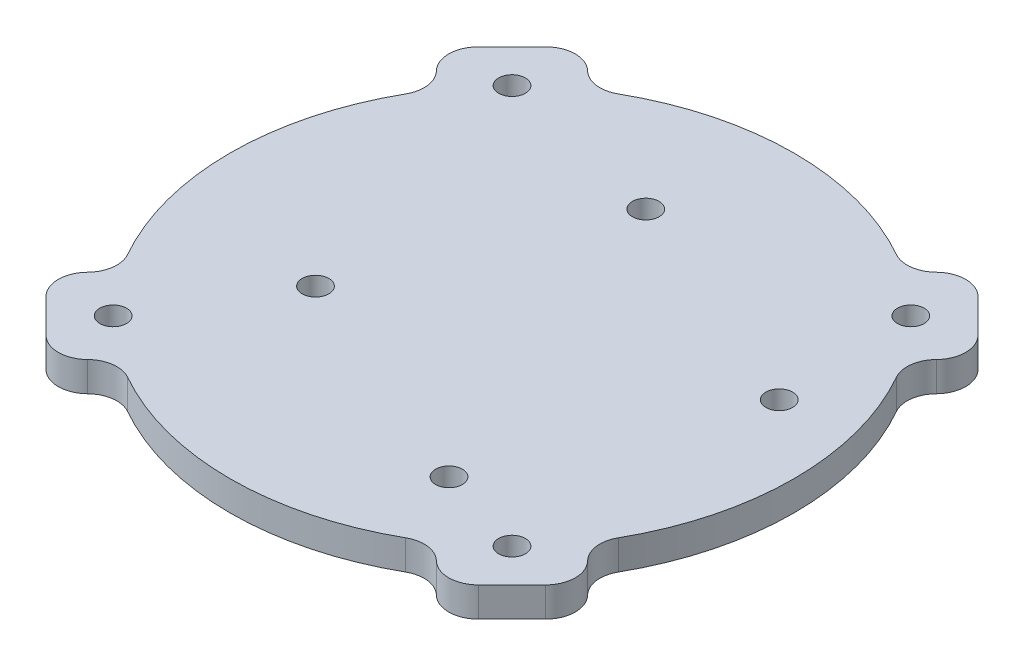
ISO-10303-21;
HEADER;
FILE_DESCRIPTION(('STEP AP214'),'2;1');
FILE_NAME('part.step','',(''),(''),'','','');
FILE_SCHEMA(('AUTOMOTIVE_DESIGN { 1 0 10303 214 1 1 1 1 }'));
ENDSEC;
DATA;
#1=APPLICATION_CONTEXT('core data for automotive mechanical design processes');
#2=APPLICATION_PROTOCOL_DEFINITION('international standard','automotive_design',2000,#1);
#3=PRODUCT_CONTEXT('',#1,'mechanical');
#4=PRODUCT('Part','Part','',(#3));
#5=PRODUCT_RELATED_PRODUCT_CATEGORY('part','',(#4));
#6=PRODUCT_DEFINITION_FORMATION('','',#4);
#7=PRODUCT_DEFINITION_CONTEXT('part definition',#1,'design');
#8=PRODUCT_DEFINITION('design','',#6,#7);
#9=PRODUCT_DEFINITION_SHAPE('','',#8);
#10=(LENGTH_UNIT() NAMED_UNIT(*) SI_UNIT(.MILLI.,.METRE.));
#11=(NAMED_UNIT(*) PLANE_ANGLE_UNIT() SI_UNIT($,.RADIAN.));
#12=(NAMED_UNIT(*) SI_UNIT($,.STERADIAN.) SOLID_ANGLE_UNIT());
#13=UNCERTAINTY_MEASURE_WITH_UNIT(LENGTH_MEASURE(1.E-05),#10,'distance_accuracy_value','');
#14=(GEOMETRIC_REPRESENTATION_CONTEXT(3) GLOBAL_UNCERTAINTY_ASSIGNED_CONTEXT((#13)) GLOBAL_UNIT_ASSIGNED_CONTEXT((#10,
#11,#12)) REPRESENTATION_CONTEXT('',''));
#15=CARTESIAN_POINT('',(0.,0.,0.));
#16=DIRECTION('',(0.,0.,1.));
#17=DIRECTION('',(1.,0.,0.));
#18=AXIS2_PLACEMENT_3D('',#15,#16,#17);
#19=CARTESIAN_POINT('',(0.,5.,0.));
#20=DIRECTION('',(0.,-1.,0.));
#21=DIRECTION('',(0.,0.,-1.));
#22=AXIS2_PLACEMENT_3D('',#19,#20,#21);
#23=CYLINDRICAL_SURFACE('',#22,47.5);
#24=CARTESIAN_POINT('',(0.,0.,0.));
#25=DIRECTION('',(0.,1.,0.));
#26=DIRECTION('',(0.,0.,1.));
#27=AXIS2_PLACEMENT_3D('',#24,#25,#26);
#28=CIRCLE('',#27,47.5);
#29=CARTESIAN_POINT('',(23.4150412443297,0.,-41.3277853692445));
#30=VERTEX_POINT('',#29);
#31=CARTESIAN_POINT('',(-23.4150412443286,0.,-41.3277853692451));
#32=VERTEX_POINT('',#31);
#33=EDGE_CURVE('E284',#30,#32,#28,.T.);
#34=ORIENTED_EDGE('',*,*,#33,.T.);
#35=DIRECTION('',(0.,-1.,0.));
#36=VECTOR('',#35,1.);
#37=CARTESIAN_POINT('',(-23.4150412443286,5.,-41.3277853692452));
#38=LINE('',#37,#36);
#39=CARTESIAN_POINT('',(-23.4150412443286,5.,-41.3277853692451));
#40=VERTEX_POINT('',#39);
#41=EDGE_CURVE('E365',#32,#40,#38,.F.);
#42=ORIENTED_EDGE('',*,*,#41,.T.);
#43=CARTESIAN_POINT('',(0.,5.,0.));
#44=DIRECTION('',(0.,1.,0.));
#45=DIRECTION('',(0.,0.,1.));
#46=AXIS2_PLACEMENT_3D('',#43,#44,#45);
#47=CIRCLE('',#46,47.5);
#48=CARTESIAN_POINT('',(23.4150412443297,5.,-41.3277853692445));
#49=VERTEX_POINT('',#48);
#50=EDGE_CURVE('E229',#49,#40,#47,.T.);
#51=ORIENTED_EDGE('',*,*,#50,.F.);
#52=DIRECTION('',(0.,-1.,0.));
#53=VECTOR('',#52,1.);
#54=CARTESIAN_POINT('',(23.4150412443297,5.,-41.3277853692445));
#55=LINE('',#54,#53);
#56=EDGE_CURVE('E362',#49,#30,#55,.T.);
#57=ORIENTED_EDGE('',*,*,#56,.T.);
#58=EDGE_LOOP('',(#34,#42,#51,#57));
#59=FACE_BOUND('',#58,.T.);
#60=ADVANCED_FACE('F43',(#59),#23,.T.);
#61=CARTESIAN_POINT('',(-32.8804653251737,5.,-38.5373195746675));
#62=DIRECTION('',(0.,-1.,0.));
#63=DIRECTION('',(0.,0.,-1.));
#64=AXIS2_PLACEMENT_3D('',#61,#62,#63);
#65=CYLINDRICAL_SURFACE('',#64,4.99999999999987);
#66=CARTESIAN_POINT('',(-32.8804653251737,5.,-38.5373195746675));
#67=DIRECTION('',(0.,1.,0.));
#68=DIRECTION('',(0.,0.,1.));
#69=AXIS2_PLACEMENT_3D('',#66,#67,#68);
#70=CIRCLE('',#69,4.99999999999987);
#71=CARTESIAN_POINT('',(-36.4159992311063,5.,-42.0728534806003));
#72=VERTEX_POINT('',#71);
#73=CARTESIAN_POINT('',(-29.3801238765579,5.,-42.1076990703376));
#74=VERTEX_POINT('',#73);
#75=EDGE_CURVE('E208',#72,#74,#70,.F.);
#76=ORIENTED_EDGE('',*,*,#75,.T.);
#77=DIRECTION('',(0.,-1.,0.));
#78=VECTOR('',#77,1.);
#79=CARTESIAN_POINT('',(-29.3801238765579,5.,-42.1076990703376));
#80=LINE('',#79,#78);
#81=CARTESIAN_POINT('',(-29.3801238765579,0.,-42.1076990703376));
#82=VERTEX_POINT('',#81);
#83=EDGE_CURVE('E360',#74,#82,#80,.T.);
#84=ORIENTED_EDGE('',*,*,#83,.T.);
#85=CARTESIAN_POINT('',(-32.8804653251737,0.,-38.5373195746675));
#86=DIRECTION('',(0.,1.,0.));
#87=DIRECTION('',(0.,0.,1.));
#88=AXIS2_PLACEMENT_3D('',#85,#86,#87);
#89=CIRCLE('',#88,4.99999999999987);
#90=CARTESIAN_POINT('',(-36.4159992311063,0.,-42.0728534806003));
#91=VERTEX_POINT('',#90);
#92=EDGE_CURVE('E211',#91,#82,#89,.F.);
#93=ORIENTED_EDGE('',*,*,#92,.F.);
#94=DIRECTION('',(0.,-1.,0.));
#95=VECTOR('',#94,1.);
#96=CARTESIAN_POINT('',(-36.4159992311063,5.,-42.0728534806003));
#97=LINE('',#96,#95);
#98=EDGE_CURVE('E204',#72,#91,#97,.T.);
#99=ORIENTED_EDGE('',*,*,#98,.F.);
#100=EDGE_LOOP('',(#76,#84,#93,#99));
#101=FACE_BOUND('',#100,.T.);
#102=ADVANCED_FACE('F206',(#101),#65,.T.);
#103=CARTESIAN_POINT('',(-39.2444263558525,5.,-39.2444263558543));
#104=DIRECTION('',(-0.707106781186531,0.,-0.707106781186564));
#105=DIRECTION('',(-0.707106781186564,0.,0.707106781186531));
#106=AXIS2_PLACEMENT_3D('',#103,#104,#105);
#107=PLANE('',#106);
#108=DIRECTION('',(0.707106781186564,0.,-0.707106781186531));
#109=VECTOR('',#108,1.);
#110=CARTESIAN_POINT('',(-39.2444263558525,0.,-39.2444263558543));
#111=LINE('',#110,#109);
#112=CARTESIAN_POINT('',(-42.0728534805988,0.,-36.4159992311081));
#113=VERTEX_POINT('',#112);
#114=EDGE_CURVE('E287',#113,#91,#111,.T.);
#115=ORIENTED_EDGE('',*,*,#114,.F.);
#116=DIRECTION('',(0.,-1.,0.));
#117=VECTOR('',#116,1.);
#118=CARTESIAN_POINT('',(-42.0728534805988,5.,-36.4159992311081));
#119=LINE('',#118,#117);
#120=CARTESIAN_POINT('',(-42.0728534805988,5.,-36.4159992311081));
#121=VERTEX_POINT('',#120);
#122=EDGE_CURVE('E217',#121,#113,#119,.T.);
#123=ORIENTED_EDGE('',*,*,#122,.F.);
#124=DIRECTION('',(0.707106781186564,0.,-0.707106781186531));
#125=VECTOR('',#124,1.);
#126=CARTESIAN_POINT('',(-39.2444263558525,5.,-39.2444263558543));
#127=LINE('',#126,#125);
#128=EDGE_CURVE('E225',#121,#72,#127,.T.);
#129=ORIENTED_EDGE('',*,*,#128,.T.);
#130=ORIENTED_EDGE('',*,*,#98,.T.);
#131=EDGE_LOOP('',(#115,#123,#129,#130));
#132=FACE_BOUND('',#131,.T.);
#133=ADVANCED_FACE('F231',(#132),#107,.T.);
#134=CARTESIAN_POINT('',(-38.5373195746662,5.,-32.8804653251752));
#135=DIRECTION('',(0.,-1.,0.));
#136=DIRECTION('',(0.,0.,-1.));
#137=AXIS2_PLACEMENT_3D('',#134,#135,#136);
#138=CYLINDRICAL_SURFACE('',#137,5.00000000000013);
#139=CARTESIAN_POINT('',(-38.5373195746662,0.,-32.8804653251752));
#140=DIRECTION('',(0.,1.,0.));
#141=DIRECTION('',(0.,0.,1.));
#142=AXIS2_PLACEMENT_3D('',#139,#140,#141);
#143=CIRCLE('',#142,5.00000000000013);
#144=CARTESIAN_POINT('',(-42.1076990703366,0.,-29.3801238765594));
#145=VERTEX_POINT('',#144);
#146=EDGE_CURVE('E289',#113,#145,#143,.T.);
#147=ORIENTED_EDGE('',*,*,#146,.T.);
#148=DIRECTION('',(0.,-1.,0.));
#149=VECTOR('',#148,1.);
#150=CARTESIAN_POINT('',(-42.1076990703366,5.,-29.3801238765594));
#151=LINE('',#150,#149);
#152=CARTESIAN_POINT('',(-42.1076990703366,5.,-29.3801238765594));
#153=VERTEX_POINT('',#152);
#154=EDGE_CURVE('E358',#145,#153,#151,.F.);
#155=ORIENTED_EDGE('',*,*,#154,.T.);
#156=CARTESIAN_POINT('',(-38.5373195746662,5.,-32.8804653251752));
#157=DIRECTION('',(0.,1.,0.));
#158=DIRECTION('',(0.,0.,1.));
#159=AXIS2_PLACEMENT_3D('',#156,#157,#158);
#160=CIRCLE('',#159,5.00000000000013);
#161=EDGE_CURVE('E233',#121,#153,#160,.T.);
#162=ORIENTED_EDGE('',*,*,#161,.F.);
#163=ORIENTED_EDGE('',*,*,#122,.T.);
#164=EDGE_LOOP('',(#147,#155,#162,#163));
#165=FACE_BOUND('',#164,.T.);
#166=ADVANCED_FACE('F462',(#165),#138,.T.);
#167=CARTESIAN_POINT('',(-41.3277853692443,0.,-23.41504124433));
#168=VERTEX_POINT('',#167);
#169=CARTESIAN_POINT('',(-41.3277853692451,0.,23.4150412443287));
#170=VERTEX_POINT('',#169);
#171=EDGE_CURVE('E292',#168,#170,#28,.T.);
#172=ORIENTED_EDGE('',*,*,#171,.T.);
#173=DIRECTION('',(0.,-1.,0.));
#174=VECTOR('',#173,1.);
#175=CARTESIAN_POINT('',(-41.3277853692451,5.,23.4150412443287));
#176=LINE('',#175,#174);
#177=CARTESIAN_POINT('',(-41.3277853692451,5.,23.4150412443287));
#178=VERTEX_POINT('',#177);
#179=EDGE_CURVE('E356',#170,#178,#176,.F.);
#180=ORIENTED_EDGE('',*,*,#179,.T.);
#181=CARTESIAN_POINT('',(-41.3277853692443,5.,-23.41504124433));
#182=VERTEX_POINT('',#181);
#183=EDGE_CURVE('E235',#182,#178,#47,.T.);
#184=ORIENTED_EDGE('',*,*,#183,.F.);
#185=DIRECTION('',(0.,-1.,0.));
#186=VECTOR('',#185,1.);
#187=CARTESIAN_POINT('',(-41.3277853692443,5.,-23.41504124433));
#188=LINE('',#187,#186);
#189=EDGE_CURVE('E353',#182,#168,#188,.T.);
#190=ORIENTED_EDGE('',*,*,#189,.T.);
#191=EDGE_LOOP('',(#172,#180,#184,#190));
#192=FACE_BOUND('',#191,.T.);
#193=ADVANCED_FACE('F469',(#192),#23,.T.);
#194=CARTESIAN_POINT('',(-38.5373195746674,5.,32.8804653251738));
#195=DIRECTION('',(0.,-1.,0.));
#196=DIRECTION('',(0.,0.,-1.));
#197=AXIS2_PLACEMENT_3D('',#194,#195,#196);
#198=CYLINDRICAL_SURFACE('',#197,4.99999999999988);
#199=CARTESIAN_POINT('',(-38.5373195746674,5.,32.8804653251738));
#200=DIRECTION('',(0.,1.,0.));
#201=DIRECTION('',(0.,0.,1.));
#202=AXIS2_PLACEMENT_3D('',#199,#200,#201);
#203=CIRCLE('',#202,4.99999999999988);
#204=CARTESIAN_POINT('',(-42.0728534806002,5.,36.4159992311065));
#205=VERTEX_POINT('',#204);
#206=CARTESIAN_POINT('',(-42.1076990703375,5.,29.3801238765581));
#207=VERTEX_POINT('',#206);
#208=EDGE_CURVE('E239',#205,#207,#203,.F.);
#209=ORIENTED_EDGE('',*,*,#208,.T.);
#210=DIRECTION('',(0.,-1.,0.));
#211=VECTOR('',#210,1.);
#212=CARTESIAN_POINT('',(-42.1076990703375,5.,29.3801238765581));
#213=LINE('',#212,#211);
#214=CARTESIAN_POINT('',(-42.1076990703375,0.,29.3801238765581));
#215=VERTEX_POINT('',#214);
#216=EDGE_CURVE('E350',#207,#215,#213,.T.);
#217=ORIENTED_EDGE('',*,*,#216,.T.);
#218=CARTESIAN_POINT('',(-38.5373195746674,0.,32.8804653251738));
#219=DIRECTION('',(0.,1.,0.));
#220=DIRECTION('',(0.,0.,1.));
#221=AXIS2_PLACEMENT_3D('',#218,#219,#220);
#222=CIRCLE('',#221,4.99999999999988);
#223=CARTESIAN_POINT('',(-42.0728534806002,0.,36.4159992311065));
#224=VERTEX_POINT('',#223);
#225=EDGE_CURVE('E293',#224,#215,#222,.F.);
#226=ORIENTED_EDGE('',*,*,#225,.F.);
#227=DIRECTION('',(0.,-1.,0.));
#228=VECTOR('',#227,1.);
#229=CARTESIAN_POINT('',(-42.0728534806002,5.,36.4159992311065));
#230=LINE('',#229,#228);
#231=EDGE_CURVE('E338',#205,#224,#230,.T.);
#232=ORIENTED_EDGE('',*,*,#231,.F.);
#233=EDGE_LOOP('',(#209,#217,#226,#232));
#234=FACE_BOUND('',#233,.T.);
#235=ADVANCED_FACE('F477',(#234),#198,.T.);
#236=CARTESIAN_POINT('',(-39.2444263558541,5.,39.2444263558527));
#237=DIRECTION('',(-0.70710678118656,0.,0.707106781186535));
#238=DIRECTION('',(0.707106781186535,0.,0.70710678118656));
#239=AXIS2_PLACEMENT_3D('',#236,#237,#238);
#240=PLANE('',#239);
#241=DIRECTION('',(-0.707106781186535,0.,-0.70710678118656));
#242=VECTOR('',#241,1.);
#243=CARTESIAN_POINT('',(-39.2444263558541,0.,39.2444263558527));
#244=LINE('',#243,#242);
#245=CARTESIAN_POINT('',(-36.4159992311079,0.,42.0728534805989));
#246=VERTEX_POINT('',#245);
#247=EDGE_CURVE('E296',#246,#224,#244,.T.);
#248=ORIENTED_EDGE('',*,*,#247,.F.);
#249=DIRECTION('',(0.,-1.,0.));
#250=VECTOR('',#249,1.);
#251=CARTESIAN_POINT('',(-36.4159992311079,5.,42.0728534805989));
#252=LINE('',#251,#250);
#253=CARTESIAN_POINT('',(-36.4159992311079,5.,42.0728534805989));
#254=VERTEX_POINT('',#253);
#255=EDGE_CURVE('E336',#254,#246,#252,.T.);
#256=ORIENTED_EDGE('',*,*,#255,.F.);
#257=DIRECTION('',(-0.707106781186535,0.,-0.70710678118656));
#258=VECTOR('',#257,1.);
#259=CARTESIAN_POINT('',(-39.2444263558541,5.,39.2444263558527));
#260=LINE('',#259,#258);
#261=EDGE_CURVE('E242',#254,#205,#260,.T.);
#262=ORIENTED_EDGE('',*,*,#261,.T.);
#263=ORIENTED_EDGE('',*,*,#231,.T.);
#264=EDGE_LOOP('',(#248,#256,#262,#263));
#265=FACE_BOUND('',#264,.T.);
#266=ADVANCED_FACE('F481',(#265),#240,.T.);
#267=CARTESIAN_POINT('',(-32.8804653251751,5.,38.5373195746663));
#268=DIRECTION('',(0.,-1.,0.));
#269=DIRECTION('',(0.,0.,-1.));
#270=AXIS2_PLACEMENT_3D('',#267,#268,#269);
#271=CYLINDRICAL_SURFACE('',#270,5.00000000000012);
#272=CARTESIAN_POINT('',(-32.8804653251751,0.,38.5373195746663));
#273=DIRECTION('',(0.,1.,0.));
#274=DIRECTION('',(0.,0.,1.));
#275=AXIS2_PLACEMENT_3D('',#272,#273,#274);
#276=CIRCLE('',#275,5.00000000000012);
#277=CARTESIAN_POINT('',(-29.3801238765593,0.,42.1076990703367));
#278=VERTEX_POINT('',#277);
#279=EDGE_CURVE('E299',#246,#278,#276,.T.);
#280=ORIENTED_EDGE('',*,*,#279,.T.);
#281=DIRECTION('',(0.,-1.,0.));
#282=VECTOR('',#281,1.);
#283=CARTESIAN_POINT('',(-29.3801238765593,5.,42.1076990703367));
#284=LINE('',#283,#282);
#285=CARTESIAN_POINT('',(-29.3801238765593,5.,42.1076990703367));
#286=VERTEX_POINT('',#285);
#287=EDGE_CURVE('E348',#278,#286,#284,.F.);
#288=ORIENTED_EDGE('',*,*,#287,.T.);
#289=CARTESIAN_POINT('',(-32.8804653251751,5.,38.5373195746663));
#290=DIRECTION('',(0.,1.,0.));
#291=DIRECTION('',(0.,0.,1.));
#292=AXIS2_PLACEMENT_3D('',#289,#290,#291);
#293=CIRCLE('',#292,5.00000000000012);
#294=EDGE_CURVE('E245',#254,#286,#293,.T.);
#295=ORIENTED_EDGE('',*,*,#294,.F.);
#296=ORIENTED_EDGE('',*,*,#255,.T.);
#297=EDGE_LOOP('',(#280,#288,#295,#296));
#298=FACE_BOUND('',#297,.T.);
#299=ADVANCED_FACE('F488',(#298),#271,.T.);
#300=CARTESIAN_POINT('',(-23.4150412443299,0.,41.3277853692444));
#301=VERTEX_POINT('',#300);
#302=CARTESIAN_POINT('',(23.4150412443288,0.,41.327785369245));
#303=VERTEX_POINT('',#302);
#304=EDGE_CURVE('E285',#301,#303,#28,.T.);
#305=ORIENTED_EDGE('',*,*,#304,.T.);
#306=DIRECTION('',(0.,-1.,0.));
#307=VECTOR('',#306,1.);
#308=CARTESIAN_POINT('',(23.4150412443288,5.,41.327785369245));
#309=LINE('',#308,#307);
#310=CARTESIAN_POINT('',(23.4150412443288,5.,41.327785369245));
#311=VERTEX_POINT('',#310);
#312=EDGE_CURVE('E346',#303,#311,#309,.F.);
#313=ORIENTED_EDGE('',*,*,#312,.T.);
#314=CARTESIAN_POINT('',(-23.4150412443299,5.,41.3277853692444));
#315=VERTEX_POINT('',#314);
#316=EDGE_CURVE('E248',#315,#311,#47,.T.);
#317=ORIENTED_EDGE('',*,*,#316,.F.);
#318=DIRECTION('',(0.,-1.,0.));
#319=VECTOR('',#318,1.);
#320=CARTESIAN_POINT('',(-23.4150412443299,5.,41.3277853692444));
#321=LINE('',#320,#319);
#322=EDGE_CURVE('E343',#315,#301,#321,.T.);
#323=ORIENTED_EDGE('',*,*,#322,.T.);
#324=EDGE_LOOP('',(#305,#313,#317,#323));
#325=FACE_BOUND('',#324,.T.);
#326=ADVANCED_FACE('F439',(#325),#23,.T.);
#327=CARTESIAN_POINT('',(32.8804653251739,5.,38.5373195746673));
#328=DIRECTION('',(0.,-1.,0.));
#329=DIRECTION('',(0.,0.,-1.));
#330=AXIS2_PLACEMENT_3D('',#327,#328,#329);
#331=CYLINDRICAL_SURFACE('',#330,4.99999999999987);
#332=CARTESIAN_POINT('',(32.8804653251739,5.,38.5373195746673));
#333=DIRECTION('',(0.,1.,0.));
#334=DIRECTION('',(0.,0.,1.));
#335=AXIS2_PLACEMENT_3D('',#332,#333,#334);
#336=CIRCLE('',#335,4.99999999999987);
#337=CARTESIAN_POINT('',(36.4159992311066,5.,42.0728534806));
#338=VERTEX_POINT('',#337);
#339=CARTESIAN_POINT('',(29.3801238765582,5.,42.1076990703374));
#340=VERTEX_POINT('',#339);
#341=EDGE_CURVE('E249',#338,#340,#336,.F.);
#342=ORIENTED_EDGE('',*,*,#341,.T.);
#343=DIRECTION('',(0.,-1.,0.));
#344=VECTOR('',#343,1.);
#345=CARTESIAN_POINT('',(29.3801238765582,5.,42.1076990703374));
#346=LINE('',#345,#344);
#347=CARTESIAN_POINT('',(29.3801238765582,0.,42.1076990703374));
#348=VERTEX_POINT('',#347);
#349=EDGE_CURVE('E216',#340,#348,#346,.T.);
#350=ORIENTED_EDGE('',*,*,#349,.T.);
#351=CARTESIAN_POINT('',(32.8804653251739,0.,38.5373195746673));
#352=DIRECTION('',(0.,1.,0.));
#353=DIRECTION('',(0.,0.,1.));
#354=AXIS2_PLACEMENT_3D('',#351,#352,#353);
#355=CIRCLE('',#354,4.99999999999987);
#356=CARTESIAN_POINT('',(36.4159992311066,0.,42.0728534806));
#357=VERTEX_POINT('',#356);
#358=EDGE_CURVE('E302',#357,#348,#355,.F.);
#359=ORIENTED_EDGE('',*,*,#358,.F.);
#360=DIRECTION('',(0.,-1.,0.));
#361=VECTOR('',#360,1.);
#362=CARTESIAN_POINT('',(36.4159992311066,5.,42.0728534806));
#363=LINE('',#362,#361);
#364=EDGE_CURVE('E334',#338,#357,#363,.T.);
#365=ORIENTED_EDGE('',*,*,#364,.F.);
#366=EDGE_LOOP('',(#342,#350,#359,#365));
#367=FACE_BOUND('',#366,.T.);
#368=ADVANCED_FACE('F432',(#367),#331,.T.);
#369=CARTESIAN_POINT('',(39.2444263558528,5.,39.244426355854));
#370=DIRECTION('',(0.707106781186537,0.,0.707106781186558));
#371=DIRECTION('',(0.707106781186558,0.,-0.707106781186537));
#372=AXIS2_PLACEMENT_3D('',#369,#370,#371);
#373=PLANE('',#372);
#374=DIRECTION('',(-0.707106781186558,0.,0.707106781186537));
#375=VECTOR('',#374,1.);
#376=CARTESIAN_POINT('',(39.2444263558528,0.,39.244426355854));
#377=LINE('',#376,#375);
#378=CARTESIAN_POINT('',(42.0728534805991,0.,36.4159992311078));
#379=VERTEX_POINT('',#378);
#380=EDGE_CURVE('E305',#379,#357,#377,.T.);
#381=ORIENTED_EDGE('',*,*,#380,.F.);
#382=DIRECTION('',(0.,-1.,0.));
#383=VECTOR('',#382,1.);
#384=CARTESIAN_POINT('',(42.0728534805991,5.,36.4159992311078));
#385=LINE('',#384,#383);
#386=CARTESIAN_POINT('',(42.0728534805991,5.,36.4159992311078));
#387=VERTEX_POINT('',#386);
#388=EDGE_CURVE('E332',#387,#379,#385,.T.);
#389=ORIENTED_EDGE('',*,*,#388,.F.);
#390=DIRECTION('',(-0.707106781186558,0.,0.707106781186537));
#391=VECTOR('',#390,1.);
#392=CARTESIAN_POINT('',(39.2444263558528,5.,39.244426355854));
#393=LINE('',#392,#391);
#394=EDGE_CURVE('E252',#387,#338,#393,.T.);
#395=ORIENTED_EDGE('',*,*,#394,.T.);
#396=ORIENTED_EDGE('',*,*,#364,.T.);
#397=EDGE_LOOP('',(#381,#389,#395,#396));
#398=FACE_BOUND('',#397,.T.);
#399=ADVANCED_FACE('F429',(#398),#373,.T.);
#400=CARTESIAN_POINT('',(38.5373195746664,5.,32.880465325175));
#401=DIRECTION('',(0.,-1.,0.));
#402=DIRECTION('',(0.,0.,-1.));
#403=AXIS2_PLACEMENT_3D('',#400,#401,#402);
#404=CYLINDRICAL_SURFACE('',#403,5.00000000000013);
#405=CARTESIAN_POINT('',(38.5373195746664,0.,32.880465325175));
#406=DIRECTION('',(0.,1.,0.));
#407=DIRECTION('',(0.,0.,1.));
#408=AXIS2_PLACEMENT_3D('',#405,#406,#407);
#409=CIRCLE('',#408,5.00000000000013);
#410=CARTESIAN_POINT('',(42.1076990703367,0.,29.3801238765592));
#411=VERTEX_POINT('',#410);
#412=EDGE_CURVE('E283',#379,#411,#409,.T.);
#413=ORIENTED_EDGE('',*,*,#412,.T.);
#414=DIRECTION('',(0.,-1.,0.));
#415=VECTOR('',#414,1.);
#416=CARTESIAN_POINT('',(42.1076990703367,5.,29.3801238765592));
#417=LINE('',#416,#415);
#418=CARTESIAN_POINT('',(42.1076990703367,5.,29.3801238765592));
#419=VERTEX_POINT('',#418);
#420=EDGE_CURVE('E58',#411,#419,#417,.F.);
#421=ORIENTED_EDGE('',*,*,#420,.T.);
#422=CARTESIAN_POINT('',(38.5373195746664,5.,32.880465325175));
#423=DIRECTION('',(0.,1.,0.));
#424=DIRECTION('',(0.,0.,1.));
#425=AXIS2_PLACEMENT_3D('',#422,#423,#424);
#426=CIRCLE('',#425,5.00000000000013);
#427=EDGE_CURVE('E255',#387,#419,#426,.T.);
#428=ORIENTED_EDGE('',*,*,#427,.F.);
#429=ORIENTED_EDGE('',*,*,#388,.T.);
#430=EDGE_LOOP('',(#413,#421,#428,#429));
#431=FACE_BOUND('',#430,.T.);
#432=ADVANCED_FACE('F426',(#431),#404,.T.);
#433=CARTESIAN_POINT('',(41.3277853692445,0.,23.4150412443298));
#434=VERTEX_POINT('',#433);
#435=CARTESIAN_POINT('',(41.3277853692449,0.,-23.415041244329));
#436=VERTEX_POINT('',#435);
#437=EDGE_CURVE('E279',#434,#436,#28,.T.);
#438=ORIENTED_EDGE('',*,*,#437,.T.);
#439=DIRECTION('',(0.,-1.,0.));
#440=VECTOR('',#439,1.);
#441=CARTESIAN_POINT('',(41.3277853692449,5.,-23.415041244329));
#442=LINE('',#441,#440);
#443=CARTESIAN_POINT('',(41.3277853692449,5.,-23.415041244329));
#444=VERTEX_POINT('',#443);
#445=EDGE_CURVE('E375',#436,#444,#442,.F.);
#446=ORIENTED_EDGE('',*,*,#445,.T.);
#447=CARTESIAN_POINT('',(41.3277853692445,5.,23.4150412443298));
#448=VERTEX_POINT('',#447);
#449=EDGE_CURVE('E257',#448,#444,#47,.T.);
#450=ORIENTED_EDGE('',*,*,#449,.F.);
#451=DIRECTION('',(0.,-1.,0.));
#452=VECTOR('',#451,1.);
#453=CARTESIAN_POINT('',(41.3277853692445,5.,23.4150412443298));
#454=LINE('',#453,#452);
#455=EDGE_CURVE('E372',#448,#434,#454,.T.);
#456=ORIENTED_EDGE('',*,*,#455,.T.);
#457=EDGE_LOOP('',(#438,#446,#450,#456));
#458=FACE_BOUND('',#457,.T.);
#459=ADVANCED_FACE('F420',(#458),#23,.T.);
#460=CARTESIAN_POINT('',(38.5373195746672,5.,-32.8804653251741));
#461=DIRECTION('',(0.,-1.,0.));
#462=DIRECTION('',(0.,0.,-1.));
#463=AXIS2_PLACEMENT_3D('',#460,#461,#462);
#464=CYLINDRICAL_SURFACE('',#463,4.99999999999988);
#465=CARTESIAN_POINT('',(38.5373195746672,5.,-32.8804653251741));
#466=DIRECTION('',(0.,1.,0.));
#467=DIRECTION('',(0.,0.,1.));
#468=AXIS2_PLACEMENT_3D('',#465,#466,#467);
#469=CIRCLE('',#468,4.99999999999988);
#470=CARTESIAN_POINT('',(42.0728534805999,5.,-36.4159992311068));
#471=VERTEX_POINT('',#470);
#472=CARTESIAN_POINT('',(42.1076990703373,5.,-29.3801238765584));
#473=VERTEX_POINT('',#472);
#474=EDGE_CURVE('E258',#471,#473,#469,.F.);
#475=ORIENTED_EDGE('',*,*,#474,.T.);
#476=DIRECTION('',(0.,-1.,0.));
#477=VECTOR('',#476,1.);
#478=CARTESIAN_POINT('',(42.1076990703373,5.,-29.3801238765584));
#479=LINE('',#478,#477);
#480=CARTESIAN_POINT('',(42.1076990703373,0.,-29.3801238765584));
#481=VERTEX_POINT('',#480);
#482=EDGE_CURVE('E369',#473,#481,#479,.T.);
#483=ORIENTED_EDGE('',*,*,#482,.T.);
#484=CARTESIAN_POINT('',(38.5373195746672,0.,-32.8804653251741));
#485=DIRECTION('',(0.,1.,0.));
#486=DIRECTION('',(0.,0.,1.));
#487=AXIS2_PLACEMENT_3D('',#484,#485,#486);
#488=CIRCLE('',#487,4.99999999999988);
#489=CARTESIAN_POINT('',(42.0728534805999,0.,-36.4159992311068));
#490=VERTEX_POINT('',#489);
#491=EDGE_CURVE('E282',#490,#481,#488,.F.);
#492=ORIENTED_EDGE('',*,*,#491,.F.);
#493=DIRECTION('',(0.,-1.,0.));
#494=VECTOR('',#493,1.);
#495=CARTESIAN_POINT('',(42.0728534805999,5.,-36.4159992311068));
#496=LINE('',#495,#494);
#497=EDGE_CURVE('E330',#471,#490,#496,.T.);
#498=ORIENTED_EDGE('',*,*,#497,.F.);
#499=EDGE_LOOP('',(#475,#483,#492,#498));
#500=FACE_BOUND('',#499,.T.);
#501=ADVANCED_FACE('F413',(#500),#464,.T.);
#502=CARTESIAN_POINT('',(39.2444263558538,5.,-39.2444263558529));
#503=DIRECTION('',(0.707106781186556,0.,-0.707106781186539));
#504=DIRECTION('',(-0.707106781186539,0.,-0.707106781186556));
#505=AXIS2_PLACEMENT_3D('',#502,#503,#504);
#506=PLANE('',#505);
#507=DIRECTION('',(0.707106781186539,0.,0.707106781186556));
#508=VECTOR('',#507,1.);
#509=CARTESIAN_POINT('',(39.2444263558538,0.,-39.2444263558529));
#510=LINE('',#509,#508);
#511=CARTESIAN_POINT('',(36.4159992311077,0.,-42.0728534805992));
#512=VERTEX_POINT('',#511);
#513=EDGE_CURVE('E311',#512,#490,#510,.T.);
#514=ORIENTED_EDGE('',*,*,#513,.F.);
#515=DIRECTION('',(0.,-1.,0.));
#516=VECTOR('',#515,1.);
#517=CARTESIAN_POINT('',(36.4159992311077,5.,-42.0728534805992));
#518=LINE('',#517,#516);
#519=CARTESIAN_POINT('',(36.4159992311077,5.,-42.0728534805992));
#520=VERTEX_POINT('',#519);
#521=EDGE_CURVE('E278',#520,#512,#518,.T.);
#522=ORIENTED_EDGE('',*,*,#521,.F.);
#523=DIRECTION('',(0.707106781186539,0.,0.707106781186556));
#524=VECTOR('',#523,1.);
#525=CARTESIAN_POINT('',(39.2444263558538,5.,-39.2444263558529));
#526=LINE('',#525,#524);
#527=EDGE_CURVE('E261',#520,#471,#526,.T.);
#528=ORIENTED_EDGE('',*,*,#527,.T.);
#529=ORIENTED_EDGE('',*,*,#497,.T.);
#530=EDGE_LOOP('',(#514,#522,#528,#529));
#531=FACE_BOUND('',#530,.T.);
#532=ADVANCED_FACE('F513',(#531),#506,.T.);
#533=CARTESIAN_POINT('',(-33.5875721063614,5.,33.5875721063606));
#534=DIRECTION('',(0.,-1.,0.));
#535=DIRECTION('',(0.,0.,-1.));
#536=AXIS2_PLACEMENT_3D('',#533,#534,#535);
#537=CYLINDRICAL_SURFACE('',#536,2.25);
#538=CARTESIAN_POINT('',(-33.5875721063614,5.,33.5875721063606));
#539=DIRECTION('',(0.,1.,0.));
#540=DIRECTION('',(0.,0.,1.));
#541=AXIS2_PLACEMENT_3D('',#538,#539,#540);
#542=CIRCLE('',#541,2.25);
#543=CARTESIAN_POINT('',(-33.5875721063614,5.,35.8375721063606));
#544=VERTEX_POINT('',#543);
#545=EDGE_CURVE('E272',#544,#544,#542,.T.);
#546=ORIENTED_EDGE('',*,*,#545,.T.);
#547=EDGE_LOOP('',(#546));
#548=FACE_BOUND('',#547,.T.);
#549=CARTESIAN_POINT('',(-33.5875721063614,0.,33.5875721063606));
#550=DIRECTION('',(0.,1.,0.));
#551=DIRECTION('',(0.,0.,1.));
#552=AXIS2_PLACEMENT_3D('',#549,#550,#551);
#553=CIRCLE('',#552,2.25);
#554=CARTESIAN_POINT('',(-33.5875721063614,0.,35.8375721063606));
#555=VERTEX_POINT('',#554);
#556=EDGE_CURVE('E323',#555,#555,#553,.T.);
#557=ORIENTED_EDGE('',*,*,#556,.F.);
#558=EDGE_LOOP('',(#557));
#559=FACE_BOUND('',#558,.T.);
#560=ADVANCED_FACE('F643',(#548,#559),#537,.F.);
#561=CARTESIAN_POINT('',(-33.5875721063605,5.,-33.5875721063615));
#562=DIRECTION('',(0.,-1.,0.));
#563=DIRECTION('',(0.,0.,-1.));
#564=AXIS2_PLACEMENT_3D('',#561,#562,#563);
#565=CYLINDRICAL_SURFACE('',#564,2.25);
#566=CARTESIAN_POINT('',(-33.5875721063605,5.,-33.5875721063615));
#567=DIRECTION('',(0.,1.,0.));
#568=DIRECTION('',(0.,0.,1.));
#569=AXIS2_PLACEMENT_3D('',#566,#567,#568);
#570=CIRCLE('',#569,2.25);
#571=CARTESIAN_POINT('',(-33.5875721063605,5.,-31.3375721063615));
#572=VERTEX_POINT('',#571);
#573=EDGE_CURVE('E269',#572,#572,#570,.T.);
#574=ORIENTED_EDGE('',*,*,#573,.T.);
#575=EDGE_LOOP('',(#574));
#576=FACE_BOUND('',#575,.T.);
#577=CARTESIAN_POINT('',(-33.5875721063605,0.,-33.5875721063615));
#578=DIRECTION('',(0.,1.,0.));
#579=DIRECTION('',(0.,0.,1.));
#580=AXIS2_PLACEMENT_3D('',#577,#578,#579);
#581=CIRCLE('',#580,2.25);
#582=CARTESIAN_POINT('',(-33.5875721063605,0.,-31.3375721063615));
#583=VERTEX_POINT('',#582);
#584=EDGE_CURVE('E320',#583,#583,#581,.T.);
#585=ORIENTED_EDGE('',*,*,#584,.F.);
#586=EDGE_LOOP('',(#585));
#587=FACE_BOUND('',#586,.T.);
#588=ADVANCED_FACE('F646',(#576,#587),#565,.F.);
#589=CARTESIAN_POINT('',(33.5875721063612,5.,-33.5875721063608));
#590=DIRECTION('',(0.,-1.,0.));
#591=DIRECTION('',(0.,0.,-1.));
#592=AXIS2_PLACEMENT_3D('',#589,#590,#591);
#593=CYLINDRICAL_SURFACE('',#592,2.25);
#594=CARTESIAN_POINT('',(33.5875721063612,5.,-33.5875721063608));
#595=DIRECTION('',(0.,1.,0.));
#596=DIRECTION('',(0.,0.,1.));
#597=AXIS2_PLACEMENT_3D('',#594,#595,#596);
#598=CIRCLE('',#597,2.25);
#599=CARTESIAN_POINT('',(33.5875721063612,5.,-31.3375721063608));
#600=VERTEX_POINT('',#599);
#601=EDGE_CURVE('E266',#600,#600,#598,.T.);
#602=ORIENTED_EDGE('',*,*,#601,.T.);
#603=EDGE_LOOP('',(#602));
#604=FACE_BOUND('',#603,.T.);
#605=CARTESIAN_POINT('',(33.5875721063612,0.,-33.5875721063608));
#606=DIRECTION('',(0.,1.,0.));
#607=DIRECTION('',(0.,0.,1.));
#608=AXIS2_PLACEMENT_3D('',#605,#606,#607);
#609=CIRCLE('',#608,2.25);
#610=CARTESIAN_POINT('',(33.5875721063612,0.,-31.3375721063608));
#611=VERTEX_POINT('',#610);
#612=EDGE_CURVE('E317',#611,#611,#609,.T.);
#613=ORIENTED_EDGE('',*,*,#612,.F.);
#614=EDGE_LOOP('',(#613));
#615=FACE_BOUND('',#614,.T.);
#616=ADVANCED_FACE('F650',(#604,#615),#593,.F.);
#617=CARTESIAN_POINT('',(32.8804653251748,5.,-38.5373195746665));
#618=DIRECTION('',(0.,-1.,0.));
#619=DIRECTION('',(0.,0.,-1.));
#620=AXIS2_PLACEMENT_3D('',#617,#618,#619);
#621=CYLINDRICAL_SURFACE('',#620,5.00000000000013);
#622=CARTESIAN_POINT('',(32.8804653251748,0.,-38.5373195746665));
#623=DIRECTION('',(0.,1.,0.));
#624=DIRECTION('',(0.,0.,1.));
#625=AXIS2_PLACEMENT_3D('',#622,#623,#624);
#626=CIRCLE('',#625,5.00000000000013);
#627=CARTESIAN_POINT('',(29.380123876559,0.,-42.1076990703369));
#628=VERTEX_POINT('',#627);
#629=EDGE_CURVE('E314',#512,#628,#626,.T.);
#630=ORIENTED_EDGE('',*,*,#629,.T.);
#631=DIRECTION('',(0.,-1.,0.));
#632=VECTOR('',#631,1.);
#633=CARTESIAN_POINT('',(29.380123876559,5.,-42.1076990703369));
#634=LINE('',#633,#632);
#635=CARTESIAN_POINT('',(29.380123876559,5.,-42.1076990703369));
#636=VERTEX_POINT('',#635);
#637=EDGE_CURVE('E367',#628,#636,#634,.F.);
#638=ORIENTED_EDGE('',*,*,#637,.T.);
#639=CARTESIAN_POINT('',(32.8804653251748,5.,-38.5373195746665));
#640=DIRECTION('',(0.,1.,0.));
#641=DIRECTION('',(0.,0.,1.));
#642=AXIS2_PLACEMENT_3D('',#639,#640,#641);
#643=CIRCLE('',#642,5.00000000000013);
#644=EDGE_CURVE('E264',#520,#636,#643,.T.);
#645=ORIENTED_EDGE('',*,*,#644,.F.);
#646=ORIENTED_EDGE('',*,*,#521,.T.);
#647=EDGE_LOOP('',(#630,#638,#645,#646));
#648=FACE_BOUND('',#647,.T.);
#649=ADVANCED_FACE('F641',(#648),#621,.T.);
#650=CARTESIAN_POINT('',(33.5875721063607,5.,33.5875721063613));
#651=DIRECTION('',(0.,-1.,0.));
#652=DIRECTION('',(0.,0.,-1.));
#653=AXIS2_PLACEMENT_3D('',#650,#651,#652);
#654=CYLINDRICAL_SURFACE('',#653,2.25);
#655=CARTESIAN_POINT('',(33.5875721063607,5.,33.5875721063613));
#656=DIRECTION('',(0.,1.,0.));
#657=DIRECTION('',(0.,0.,1.));
#658=AXIS2_PLACEMENT_3D('',#655,#656,#657);
#659=CIRCLE('',#658,2.25);
#660=CARTESIAN_POINT('',(33.5875721063607,5.,35.8375721063613));
#661=VERTEX_POINT('',#660);
#662=EDGE_CURVE('E275',#661,#661,#659,.T.);
#663=ORIENTED_EDGE('',*,*,#662,.T.);
#664=EDGE_LOOP('',(#663));
#665=FACE_BOUND('',#664,.T.);
#666=CARTESIAN_POINT('',(33.5875721063607,0.,33.5875721063613));
#667=DIRECTION('',(0.,1.,0.));
#668=DIRECTION('',(0.,0.,1.));
#669=AXIS2_PLACEMENT_3D('',#666,#667,#668);
#670=CIRCLE('',#669,2.25);
#671=CARTESIAN_POINT('',(33.5875721063607,0.,35.8375721063613));
#672=VERTEX_POINT('',#671);
#673=EDGE_CURVE('E326',#672,#672,#670,.T.);
#674=ORIENTED_EDGE('',*,*,#673,.F.);
#675=EDGE_LOOP('',(#674));
#676=FACE_BOUND('',#675,.T.);
#677=ADVANCED_FACE('F636',(#665,#676),#654,.F.);
#678=CARTESIAN_POINT('',(0.,5.,0.));
#679=DIRECTION('',(0.,1.,0.));
#680=DIRECTION('',(0.,0.,1.));
#681=AXIS2_PLACEMENT_3D('',#678,#679,#680);
#682=PLANE('',#681);
#683=CARTESIAN_POINT('',(-20.882726768653,5.,12.2139695888084));
#684=DIRECTION('',(0.,1.,0.));
#685=DIRECTION('',(0.,0.,1.));
#686=AXIS2_PLACEMENT_3D('',#683,#684,#685);
#687=CIRCLE('',#686,2.25);
#688=CARTESIAN_POINT('',(-20.882726768653,5.,14.4639695888084));
#689=VERTEX_POINT('',#688);
#690=EDGE_CURVE('E668',#689,#689,#687,.T.);
#691=ORIENTED_EDGE('',*,*,#690,.F.);
#692=EDGE_LOOP('',(#691));
#693=FACE_BOUND('',#692,.T.);
#694=CARTESIAN_POINT('',(-4.30832649071187,5.,-26.8409821513562));
#695=DIRECTION('',(0.,1.,0.));
#696=DIRECTION('',(0.,0.,1.));
#697=AXIS2_PLACEMENT_3D('',#694,#695,#696);
#698=CIRCLE('',#697,2.25);
#699=CARTESIAN_POINT('',(-4.30832649071187,5.,-24.5909821513562));
#700=VERTEX_POINT('',#699);
#701=EDGE_CURVE('E672',#700,#700,#698,.T.);
#702=ORIENTED_EDGE('',*,*,#701,.F.);
#703=EDGE_LOOP('',(#702));
#704=FACE_BOUND('',#703,.T.);
#705=CARTESIAN_POINT('',(34.7466252494527,5.,-10.2665818734151));
#706=DIRECTION('',(0.,1.,0.));
#707=DIRECTION('',(0.,0.,1.));
#708=AXIS2_PLACEMENT_3D('',#705,#706,#707);
#709=CIRCLE('',#708,2.25);
#710=CARTESIAN_POINT('',(34.7466252494527,5.,-8.01658187341512));
#711=VERTEX_POINT('',#710);
#712=EDGE_CURVE('E680',#711,#711,#709,.T.);
#713=ORIENTED_EDGE('',*,*,#712,.F.);
#714=EDGE_LOOP('',(#713));
#715=FACE_BOUND('',#714,.T.);
#716=CARTESIAN_POINT('',(18.1722249715116,5.,28.7883698667495));
#717=DIRECTION('',(0.,1.,0.));
#718=DIRECTION('',(0.,0.,1.));
#719=AXIS2_PLACEMENT_3D('',#716,#717,#718);
#720=CIRCLE('',#719,2.25);
#721=CARTESIAN_POINT('',(18.1722249715116,5.,31.0383698667495));
#722=VERTEX_POINT('',#721);
#723=EDGE_CURVE('E686',#722,#722,#720,.T.);
#724=ORIENTED_EDGE('',*,*,#723,.F.);
#725=EDGE_LOOP('',(#724));
#726=FACE_BOUND('',#725,.T.);
#727=ORIENTED_EDGE('',*,*,#644,.T.);
#728=CARTESIAN_POINT('',(25.8797824279433,5.,-45.6780785660071));
#729=DIRECTION('',(0.,1.,0.));
#730=DIRECTION('',(0.,0.,1.));
#731=AXIS2_PLACEMENT_3D('',#728,#729,#730);
#732=CIRCLE('',#731,5.);
#733=EDGE_CURVE('E399',#636,#49,#732,.F.);
#734=ORIENTED_EDGE('',*,*,#733,.T.);
#735=ORIENTED_EDGE('',*,*,#50,.T.);
#736=CARTESIAN_POINT('',(-25.8797824279421,5.,-45.6780785660078));
#737=DIRECTION('',(0.,1.,0.));
#738=DIRECTION('',(0.,0.,1.));
#739=AXIS2_PLACEMENT_3D('',#736,#737,#738);
#740=CIRCLE('',#739,5.);
#741=EDGE_CURVE('E228',#40,#74,#740,.F.);
#742=ORIENTED_EDGE('',*,*,#741,.T.);
#743=ORIENTED_EDGE('',*,*,#75,.F.);
#744=ORIENTED_EDGE('',*,*,#128,.F.);
#745=ORIENTED_EDGE('',*,*,#161,.T.);
#746=CARTESIAN_POINT('',(-45.6780785660069,5.,-25.8797824279437));
#747=DIRECTION('',(0.,1.,0.));
#748=DIRECTION('',(0.,0.,1.));
#749=AXIS2_PLACEMENT_3D('',#746,#747,#748);
#750=CIRCLE('',#749,5.);
#751=EDGE_CURVE('E392',#153,#182,#750,.F.);
#752=ORIENTED_EDGE('',*,*,#751,.T.);
#753=ORIENTED_EDGE('',*,*,#183,.T.);
#754=CARTESIAN_POINT('',(-45.6780785660077,5.,25.8797824279422));
#755=DIRECTION('',(0.,1.,0.));
#756=DIRECTION('',(0.,0.,1.));
#757=AXIS2_PLACEMENT_3D('',#754,#755,#756);
#758=CIRCLE('',#757,5.);
#759=EDGE_CURVE('E388',#178,#207,#758,.F.);
#760=ORIENTED_EDGE('',*,*,#759,.T.);
#761=ORIENTED_EDGE('',*,*,#208,.F.);
#762=ORIENTED_EDGE('',*,*,#261,.F.);
#763=ORIENTED_EDGE('',*,*,#294,.T.);
#764=CARTESIAN_POINT('',(-25.8797824279436,5.,45.6780785660069));
#765=DIRECTION('',(0.,1.,0.));
#766=DIRECTION('',(0.,0.,1.));
#767=AXIS2_PLACEMENT_3D('',#764,#765,#766);
#768=CIRCLE('',#767,5.);
#769=EDGE_CURVE('E384',#286,#315,#768,.F.);
#770=ORIENTED_EDGE('',*,*,#769,.T.);
#771=ORIENTED_EDGE('',*,*,#316,.T.);
#772=CARTESIAN_POINT('',(25.8797824279424,5.,45.6780785660076));
#773=DIRECTION('',(0.,1.,0.));
#774=DIRECTION('',(0.,0.,1.));
#775=AXIS2_PLACEMENT_3D('',#772,#773,#774);
#776=CIRCLE('',#775,5.);
#777=EDGE_CURVE('E380',#311,#340,#776,.F.);
#778=ORIENTED_EDGE('',*,*,#777,.T.);
#779=ORIENTED_EDGE('',*,*,#341,.F.);
#780=ORIENTED_EDGE('',*,*,#394,.F.);
#781=ORIENTED_EDGE('',*,*,#427,.T.);
#782=CARTESIAN_POINT('',(45.678078566007,5.,25.8797824279434));
#783=DIRECTION('',(0.,1.,0.));
#784=DIRECTION('',(0.,0.,1.));
#785=AXIS2_PLACEMENT_3D('',#782,#783,#784);
#786=CIRCLE('',#785,5.);
#787=EDGE_CURVE('E11',#419,#448,#786,.F.);
#788=ORIENTED_EDGE('',*,*,#787,.T.);
#789=ORIENTED_EDGE('',*,*,#449,.T.);
#790=CARTESIAN_POINT('',(45.6780785660075,5.,-25.8797824279426));
#791=DIRECTION('',(0.,1.,0.));
#792=DIRECTION('',(0.,0.,1.));
#793=AXIS2_PLACEMENT_3D('',#790,#791,#792);
#794=CIRCLE('',#793,5.);
#795=EDGE_CURVE('E403',#444,#473,#794,.F.);
#796=ORIENTED_EDGE('',*,*,#795,.T.);
#797=ORIENTED_EDGE('',*,*,#474,.F.);
#798=ORIENTED_EDGE('',*,*,#527,.F.);
#799=EDGE_LOOP('',(#727,#734,#735,#742,#743,#744,#745,#752,#753,#760,#761,#762,#763,#770,#771,
#778,#779,#780,#781,#788,#789,#796,#797,#798));
#800=FACE_BOUND('',#799,.T.);
#801=ORIENTED_EDGE('',*,*,#601,.F.);
#802=EDGE_LOOP('',(#801));
#803=FACE_BOUND('',#802,.T.);
#804=ORIENTED_EDGE('',*,*,#573,.F.);
#805=EDGE_LOOP('',(#804));
#806=FACE_BOUND('',#805,.T.);
#807=ORIENTED_EDGE('',*,*,#545,.F.);
#808=EDGE_LOOP('',(#807));
#809=FACE_BOUND('',#808,.T.);
#810=ORIENTED_EDGE('',*,*,#662,.F.);
#811=EDGE_LOOP('',(#810));
#812=FACE_BOUND('',#811,.T.);
#813=ADVANCED_FACE('F222',(#693,#704,#715,#726,#800,#803,#806,#809,#812),#682,.T.);
#814=CARTESIAN_POINT('',(0.,0.,0.));
#815=DIRECTION('',(0.,1.,0.));
#816=DIRECTION('',(0.,0.,1.));
#817=AXIS2_PLACEMENT_3D('',#814,#815,#816);
#818=PLANE('',#817);
#819=CARTESIAN_POINT('',(-20.882726768653,0.,12.2139695888084));
#820=DIRECTION('',(0.,1.,0.));
#821=DIRECTION('',(0.,0.,1.));
#822=AXIS2_PLACEMENT_3D('',#819,#820,#821);
#823=CIRCLE('',#822,2.25);
#824=CARTESIAN_POINT('',(-20.882726768653,0.,14.4639695888084));
#825=VERTEX_POINT('',#824);
#826=EDGE_CURVE('E666',#825,#825,#823,.T.);
#827=ORIENTED_EDGE('',*,*,#826,.T.);
#828=EDGE_LOOP('',(#827));
#829=FACE_BOUND('',#828,.T.);
#830=CARTESIAN_POINT('',(-4.30832649071187,0.,-26.8409821513562));
#831=DIRECTION('',(0.,1.,0.));
#832=DIRECTION('',(0.,0.,1.));
#833=AXIS2_PLACEMENT_3D('',#830,#831,#832);
#834=CIRCLE('',#833,2.25);
#835=CARTESIAN_POINT('',(-4.30832649071187,0.,-24.5909821513562));
#836=VERTEX_POINT('',#835);
#837=EDGE_CURVE('E677',#836,#836,#834,.T.);
#838=ORIENTED_EDGE('',*,*,#837,.T.);
#839=EDGE_LOOP('',(#838));
#840=FACE_BOUND('',#839,.T.);
#841=CARTESIAN_POINT('',(34.7466252494527,0.,-10.2665818734151));
#842=DIRECTION('',(0.,1.,0.));
#843=DIRECTION('',(0.,0.,1.));
#844=AXIS2_PLACEMENT_3D('',#841,#842,#843);
#845=CIRCLE('',#844,2.25);
#846=CARTESIAN_POINT('',(34.7466252494527,0.,-8.01658187341512));
#847=VERTEX_POINT('',#846);
#848=EDGE_CURVE('E683',#847,#847,#845,.T.);
#849=ORIENTED_EDGE('',*,*,#848,.T.);
#850=EDGE_LOOP('',(#849));
#851=FACE_BOUND('',#850,.T.);
#852=CARTESIAN_POINT('',(18.1722249715116,0.,28.7883698667495));
#853=DIRECTION('',(0.,1.,0.));
#854=DIRECTION('',(0.,0.,1.));
#855=AXIS2_PLACEMENT_3D('',#852,#853,#854);
#856=CIRCLE('',#855,2.25);
#857=CARTESIAN_POINT('',(18.1722249715116,0.,31.0383698667495));
#858=VERTEX_POINT('',#857);
#859=EDGE_CURVE('E688',#858,#858,#856,.T.);
#860=ORIENTED_EDGE('',*,*,#859,.T.);
#861=EDGE_LOOP('',(#860));
#862=FACE_BOUND('',#861,.T.);
#863=ORIENTED_EDGE('',*,*,#33,.F.);
#864=CARTESIAN_POINT('',(25.8797824279433,0.,-45.6780785660071));
#865=DIRECTION('',(0.,1.,0.));
#866=DIRECTION('',(0.,0.,1.));
#867=AXIS2_PLACEMENT_3D('',#864,#865,#866);
#868=CIRCLE('',#867,5.);
#869=EDGE_CURVE('E397',#30,#628,#868,.T.);
#870=ORIENTED_EDGE('',*,*,#869,.T.);
#871=ORIENTED_EDGE('',*,*,#629,.F.);
#872=ORIENTED_EDGE('',*,*,#513,.T.);
#873=ORIENTED_EDGE('',*,*,#491,.T.);
#874=CARTESIAN_POINT('',(45.6780785660075,0.,-25.8797824279426));
#875=DIRECTION('',(0.,1.,0.));
#876=DIRECTION('',(0.,0.,1.));
#877=AXIS2_PLACEMENT_3D('',#874,#875,#876);
#878=CIRCLE('',#877,5.);
#879=EDGE_CURVE('E401',#481,#436,#878,.T.);
#880=ORIENTED_EDGE('',*,*,#879,.T.);
#881=ORIENTED_EDGE('',*,*,#437,.F.);
#882=CARTESIAN_POINT('',(45.678078566007,0.,25.8797824279434));
#883=DIRECTION('',(0.,1.,0.));
#884=DIRECTION('',(0.,0.,1.));
#885=AXIS2_PLACEMENT_3D('',#882,#883,#884);
#886=CIRCLE('',#885,5.);
#887=EDGE_CURVE('E51',#434,#411,#886,.T.);
#888=ORIENTED_EDGE('',*,*,#887,.T.);
#889=ORIENTED_EDGE('',*,*,#412,.F.);
#890=ORIENTED_EDGE('',*,*,#380,.T.);
#891=ORIENTED_EDGE('',*,*,#358,.T.);
#892=CARTESIAN_POINT('',(25.8797824279424,0.,45.6780785660076));
#893=DIRECTION('',(0.,1.,0.));
#894=DIRECTION('',(0.,0.,1.));
#895=AXIS2_PLACEMENT_3D('',#892,#893,#894);
#896=CIRCLE('',#895,5.);
#897=EDGE_CURVE('E378',#348,#303,#896,.T.);
#898=ORIENTED_EDGE('',*,*,#897,.T.);
#899=ORIENTED_EDGE('',*,*,#304,.F.);
#900=CARTESIAN_POINT('',(-25.8797824279436,0.,45.6780785660069));
#901=DIRECTION('',(0.,1.,0.));
#902=DIRECTION('',(0.,0.,1.));
#903=AXIS2_PLACEMENT_3D('',#900,#901,#902);
#904=CIRCLE('',#903,5.);
#905=EDGE_CURVE('E382',#301,#278,#904,.T.);
#906=ORIENTED_EDGE('',*,*,#905,.T.);
#907=ORIENTED_EDGE('',*,*,#279,.F.);
#908=ORIENTED_EDGE('',*,*,#247,.T.);
#909=ORIENTED_EDGE('',*,*,#225,.T.);
#910=CARTESIAN_POINT('',(-45.6780785660077,0.,25.8797824279422));
#911=DIRECTION('',(0.,1.,0.));
#912=DIRECTION('',(0.,0.,1.));
#913=AXIS2_PLACEMENT_3D('',#910,#911,#912);
#914=CIRCLE('',#913,5.);
#915=EDGE_CURVE('E386',#215,#170,#914,.T.);
#916=ORIENTED_EDGE('',*,*,#915,.T.);
#917=ORIENTED_EDGE('',*,*,#171,.F.);
#918=CARTESIAN_POINT('',(-45.6780785660069,0.,-25.8797824279437));
#919=DIRECTION('',(0.,1.,0.));
#920=DIRECTION('',(0.,0.,1.));
#921=AXIS2_PLACEMENT_3D('',#918,#919,#920);
#922=CIRCLE('',#921,5.);
#923=EDGE_CURVE('E390',#168,#145,#922,.T.);
#924=ORIENTED_EDGE('',*,*,#923,.T.);
#925=ORIENTED_EDGE('',*,*,#146,.F.);
#926=ORIENTED_EDGE('',*,*,#114,.T.);
#927=ORIENTED_EDGE('',*,*,#92,.T.);
#928=CARTESIAN_POINT('',(-25.8797824279421,0.,-45.6780785660078));
#929=DIRECTION('',(0.,1.,0.));
#930=DIRECTION('',(0.,0.,1.));
#931=AXIS2_PLACEMENT_3D('',#928,#929,#930);
#932=CIRCLE('',#931,5.);
#933=EDGE_CURVE('E394',#82,#32,#932,.T.);
#934=ORIENTED_EDGE('',*,*,#933,.T.);
#935=EDGE_LOOP('',(#863,#870,#871,#872,#873,#880,#881,#888,#889,#890,#891,#898,#899,#906,#907,
#908,#909,#916,#917,#924,#925,#926,#927,#934));
#936=FACE_BOUND('',#935,.T.);
#937=ORIENTED_EDGE('',*,*,#612,.T.);
#938=EDGE_LOOP('',(#937));
#939=FACE_BOUND('',#938,.T.);
#940=ORIENTED_EDGE('',*,*,#584,.T.);
#941=EDGE_LOOP('',(#940));
#942=FACE_BOUND('',#941,.T.);
#943=ORIENTED_EDGE('',*,*,#556,.T.);
#944=EDGE_LOOP('',(#943));
#945=FACE_BOUND('',#944,.T.);
#946=ORIENTED_EDGE('',*,*,#673,.T.);
#947=EDGE_LOOP('',(#946));
#948=FACE_BOUND('',#947,.T.);
#949=ADVANCED_FACE('F417',(#829,#840,#851,#862,#936,#939,#942,#945,#948),#818,.F.);
#950=CARTESIAN_POINT('',(25.8797824279424,5.,45.6780785660076));
#951=DIRECTION('',(0.,1.,0.));
#952=DIRECTION('',(0.,0.,1.));
#953=AXIS2_PLACEMENT_3D('',#950,#951,#952);
#954=CYLINDRICAL_SURFACE('',#953,5.);
#955=ORIENTED_EDGE('',*,*,#777,.F.);
#956=ORIENTED_EDGE('',*,*,#312,.F.);
#957=ORIENTED_EDGE('',*,*,#897,.F.);
#958=ORIENTED_EDGE('',*,*,#349,.F.);
#959=EDGE_LOOP('',(#955,#956,#957,#958));
#960=FACE_BOUND('',#959,.T.);
#961=ADVANCED_FACE('F444',(#960),#954,.F.);
#962=CARTESIAN_POINT('',(-25.8797824279436,5.,45.6780785660069));
#963=DIRECTION('',(0.,1.,0.));
#964=DIRECTION('',(0.,0.,1.));
#965=AXIS2_PLACEMENT_3D('',#962,#963,#964);
#966=CYLINDRICAL_SURFACE('',#965,5.);
#967=ORIENTED_EDGE('',*,*,#769,.F.);
#968=ORIENTED_EDGE('',*,*,#287,.F.);
#969=ORIENTED_EDGE('',*,*,#905,.F.);
#970=ORIENTED_EDGE('',*,*,#322,.F.);
#971=EDGE_LOOP('',(#967,#968,#969,#970));
#972=FACE_BOUND('',#971,.T.);
#973=ADVANCED_FACE('F486',(#972),#966,.F.);
#974=CARTESIAN_POINT('',(-45.6780785660077,5.,25.8797824279422));
#975=DIRECTION('',(0.,1.,0.));
#976=DIRECTION('',(0.,0.,1.));
#977=AXIS2_PLACEMENT_3D('',#974,#975,#976);
#978=CYLINDRICAL_SURFACE('',#977,5.);
#979=ORIENTED_EDGE('',*,*,#759,.F.);
#980=ORIENTED_EDGE('',*,*,#179,.F.);
#981=ORIENTED_EDGE('',*,*,#915,.F.);
#982=ORIENTED_EDGE('',*,*,#216,.F.);
#983=EDGE_LOOP('',(#979,#980,#981,#982));
#984=FACE_BOUND('',#983,.T.);
#985=ADVANCED_FACE('F472',(#984),#978,.F.);
#986=CARTESIAN_POINT('',(-45.6780785660069,5.,-25.8797824279437));
#987=DIRECTION('',(0.,1.,0.));
#988=DIRECTION('',(0.,0.,1.));
#989=AXIS2_PLACEMENT_3D('',#986,#987,#988);
#990=CYLINDRICAL_SURFACE('',#989,5.);
#991=ORIENTED_EDGE('',*,*,#751,.F.);
#992=ORIENTED_EDGE('',*,*,#154,.F.);
#993=ORIENTED_EDGE('',*,*,#923,.F.);
#994=ORIENTED_EDGE('',*,*,#189,.F.);
#995=EDGE_LOOP('',(#991,#992,#993,#994));
#996=FACE_BOUND('',#995,.T.);
#997=ADVANCED_FACE('F465',(#996),#990,.F.);
#998=CARTESIAN_POINT('',(-25.8797824279421,5.,-45.6780785660078));
#999=DIRECTION('',(0.,1.,0.));
#1000=DIRECTION('',(0.,0.,1.));
#1001=AXIS2_PLACEMENT_3D('',#998,#999,#1000);
#1002=CYLINDRICAL_SURFACE('',#1001,5.);
#1003=ORIENTED_EDGE('',*,*,#741,.F.);
#1004=ORIENTED_EDGE('',*,*,#41,.F.);
#1005=ORIENTED_EDGE('',*,*,#933,.F.);
#1006=ORIENTED_EDGE('',*,*,#83,.F.);
#1007=EDGE_LOOP('',(#1003,#1004,#1005,#1006));
#1008=FACE_BOUND('',#1007,.T.);
#1009=ADVANCED_FACE('F456',(#1008),#1002,.F.);
#1010=CARTESIAN_POINT('',(25.8797824279433,5.,-45.6780785660071));
#1011=DIRECTION('',(0.,1.,0.));
#1012=DIRECTION('',(0.,0.,1.));
#1013=AXIS2_PLACEMENT_3D('',#1010,#1011,#1012);
#1014=CYLINDRICAL_SURFACE('',#1013,5.);
#1015=ORIENTED_EDGE('',*,*,#733,.F.);
#1016=ORIENTED_EDGE('',*,*,#637,.F.);
#1017=ORIENTED_EDGE('',*,*,#869,.F.);
#1018=ORIENTED_EDGE('',*,*,#56,.F.);
#1019=EDGE_LOOP('',(#1015,#1016,#1017,#1018));
#1020=FACE_BOUND('',#1019,.T.);
#1021=ADVANCED_FACE('F609',(#1020),#1014,.F.);
#1022=CARTESIAN_POINT('',(45.6780785660075,5.,-25.8797824279426));
#1023=DIRECTION('',(0.,1.,0.));
#1024=DIRECTION('',(0.,0.,1.));
#1025=AXIS2_PLACEMENT_3D('',#1022,#1023,#1024);
#1026=CYLINDRICAL_SURFACE('',#1025,5.);
#1027=ORIENTED_EDGE('',*,*,#795,.F.);
#1028=ORIENTED_EDGE('',*,*,#445,.F.);
#1029=ORIENTED_EDGE('',*,*,#879,.F.);
#1030=ORIENTED_EDGE('',*,*,#482,.F.);
#1031=EDGE_LOOP('',(#1027,#1028,#1029,#1030));
#1032=FACE_BOUND('',#1031,.T.);
#1033=ADVANCED_FACE('F415',(#1032),#1026,.F.);
#1034=CARTESIAN_POINT('',(45.678078566007,5.,25.8797824279434));
#1035=DIRECTION('',(0.,1.,0.));
#1036=DIRECTION('',(0.,0.,1.));
#1037=AXIS2_PLACEMENT_3D('',#1034,#1035,#1036);
#1038=CYLINDRICAL_SURFACE('',#1037,5.);
#1039=ORIENTED_EDGE('',*,*,#787,.F.);
#1040=ORIENTED_EDGE('',*,*,#420,.F.);
#1041=ORIENTED_EDGE('',*,*,#887,.F.);
#1042=ORIENTED_EDGE('',*,*,#455,.F.);
#1043=EDGE_LOOP('',(#1039,#1040,#1041,#1042));
#1044=FACE_BOUND('',#1043,.T.);
#1045=ADVANCED_FACE('F45',(#1044),#1038,.F.);
#1046=CARTESIAN_POINT('',(18.1722249715116,0.,28.7883698667495));
#1047=DIRECTION('',(0.,1.,0.));
#1048=DIRECTION('',(0.,0.,1.));
#1049=AXIS2_PLACEMENT_3D('',#1046,#1047,#1048);
#1050=CYLINDRICAL_SURFACE('',#1049,2.25);
#1051=ORIENTED_EDGE('',*,*,#859,.F.);
#1052=EDGE_LOOP('',(#1051));
#1053=FACE_BOUND('',#1052,.T.);
#1054=ORIENTED_EDGE('',*,*,#723,.T.);
#1055=EDGE_LOOP('',(#1054));
#1056=FACE_BOUND('',#1055,.T.);
#1057=ADVANCED_FACE('F616',(#1053,#1056),#1050,.F.);
#1058=CARTESIAN_POINT('',(34.7466252494527,0.,-10.2665818734151));
#1059=DIRECTION('',(0.,1.,0.));
#1060=DIRECTION('',(0.,0.,1.));
#1061=AXIS2_PLACEMENT_3D('',#1058,#1059,#1060);
#1062=CYLINDRICAL_SURFACE('',#1061,2.25);
#1063=ORIENTED_EDGE('',*,*,#848,.F.);
#1064=EDGE_LOOP('',(#1063));
#1065=FACE_BOUND('',#1064,.T.);
#1066=ORIENTED_EDGE('',*,*,#712,.T.);
#1067=EDGE_LOOP('',(#1066));
#1068=FACE_BOUND('',#1067,.T.);
#1069=ADVANCED_FACE('F621',(#1065,#1068),#1062,.F.);
#1070=CARTESIAN_POINT('',(-4.30832649071187,0.,-26.8409821513562));
#1071=DIRECTION('',(0.,1.,0.));
#1072=DIRECTION('',(0.,0.,1.));
#1073=AXIS2_PLACEMENT_3D('',#1070,#1071,#1072);
#1074=CYLINDRICAL_SURFACE('',#1073,2.25);
#1075=ORIENTED_EDGE('',*,*,#837,.F.);
#1076=EDGE_LOOP('',(#1075));
#1077=FACE_BOUND('',#1076,.T.);
#1078=ORIENTED_EDGE('',*,*,#701,.T.);
#1079=EDGE_LOOP('',(#1078));
#1080=FACE_BOUND('',#1079,.T.);
#1081=ADVANCED_FACE('F628',(#1077,#1080),#1074,.F.);
#1082=CARTESIAN_POINT('',(-20.882726768653,0.,12.2139695888084));
#1083=DIRECTION('',(0.,1.,0.));
#1084=DIRECTION('',(0.,0.,1.));
#1085=AXIS2_PLACEMENT_3D('',#1082,#1083,#1084);
#1086=CYLINDRICAL_SURFACE('',#1085,2.25);
#1087=ORIENTED_EDGE('',*,*,#826,.F.);
#1088=EDGE_LOOP('',(#1087));
#1089=FACE_BOUND('',#1088,.T.);
#1090=ORIENTED_EDGE('',*,*,#690,.T.);
#1091=EDGE_LOOP('',(#1090));
#1092=FACE_BOUND('',#1091,.T.);
#1093=ADVANCED_FACE('F703',(#1089,#1092),#1086,.F.);
#1094=CLOSED_SHELL('',(#60,#102,#133,#166,#193,#235,#266,#299,#326,#368,#399,#432,#459,#501,
#532,#560,#588,#616,#649,#677,#813,#949,#961,#973,#985,#997,#1009,#1021,#1033,#1045,#1057,#1069,
#1081,#1093));
#1095=MANIFOLD_SOLID_BREP('B2',#1094);
#1096=ADVANCED_BREP_SHAPE_REPRESENTATION('',(#18,#1095),#14);
#1097=SHAPE_DEFINITION_REPRESENTATION(#9,#1096);
ENDSEC;
END-ISO-10303-21;
